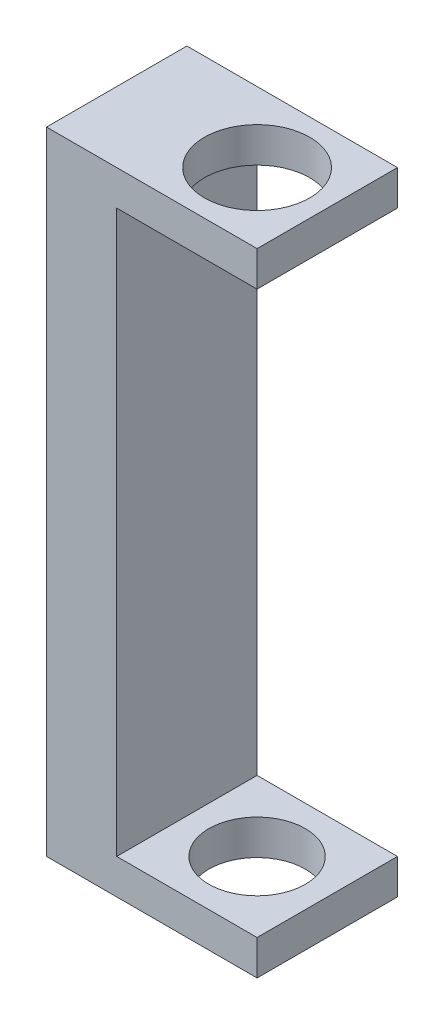
ISO-10303-21;
HEADER;
FILE_DESCRIPTION(('STEP AP214'),'2;1');
FILE_NAME('part.step','',(''),(''),'','','');
FILE_SCHEMA(('AUTOMOTIVE_DESIGN { 1 0 10303 214 1 1 1 1 }'));
ENDSEC;
DATA;
#1=APPLICATION_CONTEXT('core data for automotive mechanical design processes');
#2=APPLICATION_PROTOCOL_DEFINITION('international standard','automotive_design',2000,#1);
#3=PRODUCT_CONTEXT('',#1,'mechanical');
#4=PRODUCT('Part','Part','',(#3));
#5=PRODUCT_RELATED_PRODUCT_CATEGORY('part','',(#4));
#6=PRODUCT_DEFINITION_FORMATION('','',#4);
#7=PRODUCT_DEFINITION_CONTEXT('part definition',#1,'design');
#8=PRODUCT_DEFINITION('design','',#6,#7);
#9=PRODUCT_DEFINITION_SHAPE('','',#8);
#10=(LENGTH_UNIT() NAMED_UNIT(*) SI_UNIT(.MILLI.,.METRE.));
#11=(NAMED_UNIT(*) PLANE_ANGLE_UNIT() SI_UNIT($,.RADIAN.));
#12=(NAMED_UNIT(*) SI_UNIT($,.STERADIAN.) SOLID_ANGLE_UNIT());
#13=UNCERTAINTY_MEASURE_WITH_UNIT(LENGTH_MEASURE(1.E-05),#10,'distance_accuracy_value','');
#14=(GEOMETRIC_REPRESENTATION_CONTEXT(3) GLOBAL_UNCERTAINTY_ASSIGNED_CONTEXT((#13)) GLOBAL_UNIT_ASSIGNED_CONTEXT((#10,
#11,#12)) REPRESENTATION_CONTEXT('',''));
#15=CARTESIAN_POINT('',(0.,0.,0.));
#16=DIRECTION('',(0.,0.,1.));
#17=DIRECTION('',(1.,0.,0.));
#18=AXIS2_PLACEMENT_3D('',#15,#16,#17);
#19=CARTESIAN_POINT('',(76.2,228.6,0.));
#20=DIRECTION('',(-1.,0.,0.));
#21=DIRECTION('',(0.,0.,1.));
#22=AXIS2_PLACEMENT_3D('',#19,#20,#21);
#23=PLANE('',#22);
#24=DIRECTION('',(0.,-1.,0.));
#25=VECTOR('',#24,1.);
#26=CARTESIAN_POINT('',(76.2,228.6,-50.8));
#27=LINE('',#26,#25);
#28=CARTESIAN_POINT('',(76.2,12.7,-50.8));
#29=VERTEX_POINT('',#28);
#30=CARTESIAN_POINT('',(76.2,0.,-50.8));
#31=VERTEX_POINT('',#30);
#32=EDGE_CURVE('E207',#29,#31,#27,.T.);
#33=ORIENTED_EDGE('',*,*,#32,.F.);
#34=DIRECTION('',(0.,0.,1.));
#35=VECTOR('',#34,1.);
#36=CARTESIAN_POINT('',(76.2,12.7,-50.8));
#37=LINE('',#36,#35);
#38=CARTESIAN_POINT('',(76.2,12.7,0.));
#39=VERTEX_POINT('',#38);
#40=EDGE_CURVE('E181',#29,#39,#37,.T.);
#41=ORIENTED_EDGE('',*,*,#40,.T.);
#42=DIRECTION('',(0.,-1.,0.));
#43=VECTOR('',#42,1.);
#44=CARTESIAN_POINT('',(76.2,228.6,0.));
#45=LINE('',#44,#43);
#46=CARTESIAN_POINT('',(76.2,0.,0.));
#47=VERTEX_POINT('',#46);
#48=EDGE_CURVE('E210',#39,#47,#45,.T.);
#49=ORIENTED_EDGE('',*,*,#48,.T.);
#50=DIRECTION('',(0.,0.,-1.));
#51=VECTOR('',#50,1.);
#52=CARTESIAN_POINT('',(76.2,0.,0.));
#53=LINE('',#52,#51);
#54=EDGE_CURVE('E202',#47,#31,#53,.T.);
#55=ORIENTED_EDGE('',*,*,#54,.T.);
#56=EDGE_LOOP('',(#33,#41,#49,#55));
#57=FACE_BOUND('',#56,.T.);
#58=ADVANCED_FACE('F37',(#57),#23,.F.);
#59=CARTESIAN_POINT('',(0.,228.6,0.));
#60=DIRECTION('',(1.,0.,0.));
#61=DIRECTION('',(0.,0.,-1.));
#62=AXIS2_PLACEMENT_3D('',#59,#60,#61);
#63=PLANE('',#62);
#64=DIRECTION('',(0.,0.,1.));
#65=VECTOR('',#64,1.);
#66=CARTESIAN_POINT('',(0.,0.,0.));
#67=LINE('',#66,#65);
#68=CARTESIAN_POINT('',(0.,0.,-50.8));
#69=VERTEX_POINT('',#68);
#70=CARTESIAN_POINT('',(0.,0.,0.));
#71=VERTEX_POINT('',#70);
#72=EDGE_CURVE('E184',#69,#71,#67,.T.);
#73=ORIENTED_EDGE('',*,*,#72,.T.);
#74=DIRECTION('',(0.,-1.,0.));
#75=VECTOR('',#74,1.);
#76=CARTESIAN_POINT('',(0.,228.6,0.));
#77=LINE('',#76,#75);
#78=CARTESIAN_POINT('',(0.,228.6,0.));
#79=VERTEX_POINT('',#78);
#80=EDGE_CURVE('E11',#79,#71,#77,.T.);
#81=ORIENTED_EDGE('',*,*,#80,.F.);
#82=DIRECTION('',(0.,0.,1.));
#83=VECTOR('',#82,1.);
#84=CARTESIAN_POINT('',(0.,228.6,0.));
#85=LINE('',#84,#83);
#86=CARTESIAN_POINT('',(0.,228.6,-50.8));
#87=VERTEX_POINT('',#86);
#88=EDGE_CURVE('E190',#87,#79,#85,.T.);
#89=ORIENTED_EDGE('',*,*,#88,.F.);
#90=DIRECTION('',(0.,-1.,0.));
#91=VECTOR('',#90,1.);
#92=CARTESIAN_POINT('',(0.,228.6,-50.8));
#93=LINE('',#92,#91);
#94=EDGE_CURVE('E196',#87,#69,#93,.T.);
#95=ORIENTED_EDGE('',*,*,#94,.T.);
#96=EDGE_LOOP('',(#73,#81,#89,#95));
#97=FACE_BOUND('',#96,.T.);
#98=ADVANCED_FACE('F39',(#97),#63,.F.);
#99=CARTESIAN_POINT('',(0.,228.6,0.));
#100=DIRECTION('',(0.,0.,-1.));
#101=DIRECTION('',(-1.,0.,0.));
#102=AXIS2_PLACEMENT_3D('',#99,#100,#101);
#103=PLANE('',#102);
#104=ORIENTED_EDGE('',*,*,#48,.F.);
#105=DIRECTION('',(1.,0.,0.));
#106=VECTOR('',#105,1.);
#107=CARTESIAN_POINT('',(76.2,12.7,0.));
#108=LINE('',#107,#106);
#109=CARTESIAN_POINT('',(25.4,12.7,0.));
#110=VERTEX_POINT('',#109);
#111=EDGE_CURVE('E169',#110,#39,#108,.T.);
#112=ORIENTED_EDGE('',*,*,#111,.F.);
#113=DIRECTION('',(0.,-1.,0.));
#114=VECTOR('',#113,1.);
#115=CARTESIAN_POINT('',(25.4,215.9,0.));
#116=LINE('',#115,#114);
#117=CARTESIAN_POINT('',(25.4,215.9,0.));
#118=VERTEX_POINT('',#117);
#119=EDGE_CURVE('E177',#118,#110,#116,.T.);
#120=ORIENTED_EDGE('',*,*,#119,.F.);
#121=DIRECTION('',(-1.,0.,0.));
#122=VECTOR('',#121,1.);
#123=CARTESIAN_POINT('',(76.2,215.9,0.));
#124=LINE('',#123,#122);
#125=CARTESIAN_POINT('',(76.2,215.9,0.));
#126=VERTEX_POINT('',#125);
#127=EDGE_CURVE('E165',#126,#118,#124,.T.);
#128=ORIENTED_EDGE('',*,*,#127,.F.);
#129=CARTESIAN_POINT('',(76.2,228.6,0.));
#130=VERTEX_POINT('',#129);
#131=EDGE_CURVE('E45',#130,#126,#45,.T.);
#132=ORIENTED_EDGE('',*,*,#131,.F.);
#133=DIRECTION('',(1.,0.,0.));
#134=VECTOR('',#133,1.);
#135=CARTESIAN_POINT('',(0.,228.6,0.));
#136=LINE('',#135,#134);
#137=EDGE_CURVE('E88',#79,#130,#136,.T.);
#138=ORIENTED_EDGE('',*,*,#137,.F.);
#139=ORIENTED_EDGE('',*,*,#80,.T.);
#140=DIRECTION('',(1.,0.,0.));
#141=VECTOR('',#140,1.);
#142=CARTESIAN_POINT('',(0.,0.,0.));
#143=LINE('',#142,#141);
#144=EDGE_CURVE('E199',#71,#47,#143,.T.);
#145=ORIENTED_EDGE('',*,*,#144,.T.);
#146=EDGE_LOOP('',(#104,#112,#120,#128,#132,#138,#139,#145));
#147=FACE_BOUND('',#146,.T.);
#148=ADVANCED_FACE('F220',(#147),#103,.F.);
#149=ORIENTED_EDGE('',*,*,#131,.T.);
#150=DIRECTION('',(0.,0.,1.));
#151=VECTOR('',#150,1.);
#152=CARTESIAN_POINT('',(76.2,215.9,-50.8));
#153=LINE('',#152,#151);
#154=CARTESIAN_POINT('',(76.2,215.9,-50.8));
#155=VERTEX_POINT('',#154);
#156=EDGE_CURVE('E174',#155,#126,#153,.T.);
#157=ORIENTED_EDGE('',*,*,#156,.F.);
#158=CARTESIAN_POINT('',(76.2,228.6,-50.8));
#159=VERTEX_POINT('',#158);
#160=EDGE_CURVE('E208',#159,#155,#27,.T.);
#161=ORIENTED_EDGE('',*,*,#160,.F.);
#162=DIRECTION('',(0.,0.,-1.));
#163=VECTOR('',#162,1.);
#164=CARTESIAN_POINT('',(76.2,228.6,0.));
#165=LINE('',#164,#163);
#166=EDGE_CURVE('E193',#130,#159,#165,.T.);
#167=ORIENTED_EDGE('',*,*,#166,.F.);
#168=EDGE_LOOP('',(#149,#157,#161,#167));
#169=FACE_BOUND('',#168,.T.);
#170=ADVANCED_FACE('F229',(#169),#23,.F.);
#171=CARTESIAN_POINT('',(0.,228.6,-50.8));
#172=DIRECTION('',(0.,0.,1.));
#173=DIRECTION('',(1.,0.,0.));
#174=AXIS2_PLACEMENT_3D('',#171,#172,#173);
#175=PLANE('',#174);
#176=DIRECTION('',(0.,-1.,0.));
#177=VECTOR('',#176,1.);
#178=CARTESIAN_POINT('',(25.4,215.9,-50.8));
#179=LINE('',#178,#177);
#180=CARTESIAN_POINT('',(25.4,215.9,-50.8));
#181=VERTEX_POINT('',#180);
#182=CARTESIAN_POINT('',(25.4,12.7,-50.8));
#183=VERTEX_POINT('',#182);
#184=EDGE_CURVE('E52',#181,#183,#179,.T.);
#185=ORIENTED_EDGE('',*,*,#184,.T.);
#186=DIRECTION('',(1.,0.,0.));
#187=VECTOR('',#186,1.);
#188=CARTESIAN_POINT('',(76.2,12.7,-50.8));
#189=LINE('',#188,#187);
#190=EDGE_CURVE('E171',#183,#29,#189,.T.);
#191=ORIENTED_EDGE('',*,*,#190,.T.);
#192=ORIENTED_EDGE('',*,*,#32,.T.);
#193=DIRECTION('',(-1.,0.,0.));
#194=VECTOR('',#193,1.);
#195=CARTESIAN_POINT('',(0.,0.,-50.8));
#196=LINE('',#195,#194);
#197=EDGE_CURVE('E81',#31,#69,#196,.T.);
#198=ORIENTED_EDGE('',*,*,#197,.T.);
#199=ORIENTED_EDGE('',*,*,#94,.F.);
#200=DIRECTION('',(-1.,0.,0.));
#201=VECTOR('',#200,1.);
#202=CARTESIAN_POINT('',(0.,228.6,-50.8));
#203=LINE('',#202,#201);
#204=EDGE_CURVE('E61',#159,#87,#203,.T.);
#205=ORIENTED_EDGE('',*,*,#204,.F.);
#206=ORIENTED_EDGE('',*,*,#160,.T.);
#207=DIRECTION('',(-1.,0.,0.));
#208=VECTOR('',#207,1.);
#209=CARTESIAN_POINT('',(76.2,215.9,-50.8));
#210=LINE('',#209,#208);
#211=EDGE_CURVE('E166',#155,#181,#210,.T.);
#212=ORIENTED_EDGE('',*,*,#211,.T.);
#213=EDGE_LOOP('',(#185,#191,#192,#198,#199,#205,#206,#212));
#214=FACE_BOUND('',#213,.T.);
#215=ADVANCED_FACE('F227',(#214),#175,.F.);
#216=CARTESIAN_POINT('',(0.,228.6,0.));
#217=DIRECTION('',(0.,-1.,0.));
#218=DIRECTION('',(0.,0.,-1.));
#219=AXIS2_PLACEMENT_3D('',#216,#217,#218);
#220=PLANE('',#219);
#221=CARTESIAN_POINT('',(50.8,228.6,-25.4));
#222=DIRECTION('',(0.,1.,0.));
#223=DIRECTION('',(0.,0.,1.));
#224=AXIS2_PLACEMENT_3D('',#221,#222,#223);
#225=CIRCLE('',#224,19.05);
#226=CARTESIAN_POINT('',(50.8,228.6,-6.35));
#227=VERTEX_POINT('',#226);
#228=EDGE_CURVE('E162',#227,#227,#225,.T.);
#229=ORIENTED_EDGE('',*,*,#228,.F.);
#230=EDGE_LOOP('',(#229));
#231=FACE_BOUND('',#230,.T.);
#232=ORIENTED_EDGE('',*,*,#88,.T.);
#233=ORIENTED_EDGE('',*,*,#137,.T.);
#234=ORIENTED_EDGE('',*,*,#166,.T.);
#235=ORIENTED_EDGE('',*,*,#204,.T.);
#236=EDGE_LOOP('',(#232,#233,#234,#235));
#237=FACE_BOUND('',#236,.T.);
#238=ADVANCED_FACE('F246',(#231,#237),#220,.F.);
#239=CARTESIAN_POINT('',(0.,0.,0.));
#240=DIRECTION('',(0.,-1.,0.));
#241=DIRECTION('',(0.,0.,-1.));
#242=AXIS2_PLACEMENT_3D('',#239,#240,#241);
#243=PLANE('',#242);
#244=CARTESIAN_POINT('',(6.34999999999999,0.,-44.45));
#245=DIRECTION('',(0.,-1.,0.));
#246=DIRECTION('',(0.,0.,-1.));
#247=AXIS2_PLACEMENT_3D('',#244,#245,#246);
#248=CIRCLE('',#247,2.0193);
#249=CARTESIAN_POINT('',(6.34999999999999,0.,-46.4693));
#250=VERTEX_POINT('',#249);
#251=EDGE_CURVE('E131',#250,#250,#248,.T.);
#252=ORIENTED_EDGE('',*,*,#251,.F.);
#253=EDGE_LOOP('',(#252));
#254=FACE_BOUND('',#253,.T.);
#255=CARTESIAN_POINT('',(19.0500000000001,0.,-44.45));
#256=DIRECTION('',(0.,-1.,0.));
#257=DIRECTION('',(0.,0.,-1.));
#258=AXIS2_PLACEMENT_3D('',#255,#256,#257);
#259=CIRCLE('',#258,2.0193);
#260=CARTESIAN_POINT('',(19.0500000000001,0.,-46.4693));
#261=VERTEX_POINT('',#260);
#262=EDGE_CURVE('E130',#261,#261,#259,.T.);
#263=ORIENTED_EDGE('',*,*,#262,.F.);
#264=EDGE_LOOP('',(#263));
#265=FACE_BOUND('',#264,.T.);
#266=CARTESIAN_POINT('',(6.34999999999998,0.,-6.35));
#267=DIRECTION('',(0.,-1.,0.));
#268=DIRECTION('',(0.,0.,-1.));
#269=AXIS2_PLACEMENT_3D('',#266,#267,#268);
#270=CIRCLE('',#269,2.0193);
#271=CARTESIAN_POINT('',(6.34999999999998,0.,-8.3693));
#272=VERTEX_POINT('',#271);
#273=EDGE_CURVE('E141',#272,#272,#270,.T.);
#274=ORIENTED_EDGE('',*,*,#273,.F.);
#275=EDGE_LOOP('',(#274));
#276=FACE_BOUND('',#275,.T.);
#277=CARTESIAN_POINT('',(19.0500000000001,0.,-6.35));
#278=DIRECTION('',(0.,-1.,0.));
#279=DIRECTION('',(0.,0.,-1.));
#280=AXIS2_PLACEMENT_3D('',#277,#278,#279);
#281=CIRCLE('',#280,2.0193);
#282=CARTESIAN_POINT('',(19.0500000000001,0.,-8.3693));
#283=VERTEX_POINT('',#282);
#284=EDGE_CURVE('E147',#283,#283,#281,.T.);
#285=ORIENTED_EDGE('',*,*,#284,.F.);
#286=EDGE_LOOP('',(#285));
#287=FACE_BOUND('',#286,.T.);
#288=CARTESIAN_POINT('',(50.8,0.,-25.4));
#289=DIRECTION('',(0.,-1.,0.));
#290=DIRECTION('',(0.,0.,-1.));
#291=AXIS2_PLACEMENT_3D('',#288,#289,#290);
#292=CIRCLE('',#291,17.4625);
#293=CARTESIAN_POINT('',(50.8,0.,-42.8625));
#294=VERTEX_POINT('',#293);
#295=EDGE_CURVE('E153',#294,#294,#292,.T.);
#296=ORIENTED_EDGE('',*,*,#295,.F.);
#297=EDGE_LOOP('',(#296));
#298=FACE_BOUND('',#297,.T.);
#299=ORIENTED_EDGE('',*,*,#72,.F.);
#300=ORIENTED_EDGE('',*,*,#197,.F.);
#301=ORIENTED_EDGE('',*,*,#54,.F.);
#302=ORIENTED_EDGE('',*,*,#144,.F.);
#303=EDGE_LOOP('',(#299,#300,#301,#302));
#304=FACE_BOUND('',#303,.T.);
#305=ADVANCED_FACE('F224',(#254,#265,#276,#287,#298,#304),#243,.T.);
#306=CARTESIAN_POINT('',(76.2,12.7,-50.8));
#307=DIRECTION('',(0.,-1.,0.));
#308=DIRECTION('',(0.,0.,-1.));
#309=AXIS2_PLACEMENT_3D('',#306,#307,#308);
#310=PLANE('',#309);
#311=CARTESIAN_POINT('',(50.8,12.7,-25.4));
#312=DIRECTION('',(0.,-1.,0.));
#313=DIRECTION('',(0.,0.,-1.));
#314=AXIS2_PLACEMENT_3D('',#311,#312,#313);
#315=CIRCLE('',#314,17.4625);
#316=CARTESIAN_POINT('',(50.8,12.7,-42.8625));
#317=VERTEX_POINT('',#316);
#318=EDGE_CURVE('E156',#317,#317,#315,.F.);
#319=ORIENTED_EDGE('',*,*,#318,.F.);
#320=EDGE_LOOP('',(#319));
#321=FACE_BOUND('',#320,.T.);
#322=ORIENTED_EDGE('',*,*,#111,.T.);
#323=ORIENTED_EDGE('',*,*,#40,.F.);
#324=ORIENTED_EDGE('',*,*,#190,.F.);
#325=DIRECTION('',(0.,0.,1.));
#326=VECTOR('',#325,1.);
#327=CARTESIAN_POINT('',(25.4,12.7,-50.8));
#328=LINE('',#327,#326);
#329=EDGE_CURVE('E185',#183,#110,#328,.T.);
#330=ORIENTED_EDGE('',*,*,#329,.T.);
#331=EDGE_LOOP('',(#322,#323,#324,#330));
#332=FACE_BOUND('',#331,.T.);
#333=ADVANCED_FACE('F237',(#321,#332),#310,.F.);
#334=CARTESIAN_POINT('',(25.4,215.9,-50.8));
#335=DIRECTION('',(-1.,0.,0.));
#336=DIRECTION('',(0.,-1.,0.));
#337=AXIS2_PLACEMENT_3D('',#334,#335,#336);
#338=PLANE('',#337);
#339=ORIENTED_EDGE('',*,*,#119,.T.);
#340=ORIENTED_EDGE('',*,*,#329,.F.);
#341=ORIENTED_EDGE('',*,*,#184,.F.);
#342=DIRECTION('',(0.,0.,1.));
#343=VECTOR('',#342,1.);
#344=CARTESIAN_POINT('',(25.4,215.9,-50.8));
#345=LINE('',#344,#343);
#346=EDGE_CURVE('E187',#181,#118,#345,.T.);
#347=ORIENTED_EDGE('',*,*,#346,.T.);
#348=EDGE_LOOP('',(#339,#340,#341,#347));
#349=FACE_BOUND('',#348,.T.);
#350=ADVANCED_FACE('F234',(#349),#338,.F.);
#351=CARTESIAN_POINT('',(76.2,215.9,-50.8));
#352=DIRECTION('',(0.,1.,0.));
#353=DIRECTION('',(0.,0.,1.));
#354=AXIS2_PLACEMENT_3D('',#351,#352,#353);
#355=PLANE('',#354);
#356=CARTESIAN_POINT('',(50.8,215.9,-25.4));
#357=DIRECTION('',(0.,1.,0.));
#358=DIRECTION('',(0.,0.,1.));
#359=AXIS2_PLACEMENT_3D('',#356,#357,#358);
#360=CIRCLE('',#359,19.05);
#361=CARTESIAN_POINT('',(50.8,215.9,-6.35));
#362=VERTEX_POINT('',#361);
#363=EDGE_CURVE('E159',#362,#362,#360,.F.);
#364=ORIENTED_EDGE('',*,*,#363,.F.);
#365=EDGE_LOOP('',(#364));
#366=FACE_BOUND('',#365,.T.);
#367=ORIENTED_EDGE('',*,*,#127,.T.);
#368=ORIENTED_EDGE('',*,*,#346,.F.);
#369=ORIENTED_EDGE('',*,*,#211,.F.);
#370=ORIENTED_EDGE('',*,*,#156,.T.);
#371=EDGE_LOOP('',(#367,#368,#369,#370));
#372=FACE_BOUND('',#371,.T.);
#373=ADVANCED_FACE('F232',(#366,#372),#355,.F.);
#374=CARTESIAN_POINT('',(50.8,-0.001000000000001,-25.4));
#375=DIRECTION('',(0.,1.,0.));
#376=DIRECTION('',(0.,0.,1.));
#377=AXIS2_PLACEMENT_3D('',#374,#375,#376);
#378=CYLINDRICAL_SURFACE('',#377,19.05);
#379=ORIENTED_EDGE('',*,*,#228,.T.);
#380=EDGE_LOOP('',(#379));
#381=FACE_BOUND('',#380,.T.);
#382=ORIENTED_EDGE('',*,*,#363,.T.);
#383=EDGE_LOOP('',(#382));
#384=FACE_BOUND('',#383,.T.);
#385=ADVANCED_FACE('F300',(#381,#384),#378,.F.);
#386=CARTESIAN_POINT('',(50.8,228.601,-25.4));
#387=DIRECTION('',(0.,-1.,0.));
#388=DIRECTION('',(0.,0.,-1.));
#389=AXIS2_PLACEMENT_3D('',#386,#387,#388);
#390=CYLINDRICAL_SURFACE('',#389,17.4625);
#391=ORIENTED_EDGE('',*,*,#295,.T.);
#392=EDGE_LOOP('',(#391));
#393=FACE_BOUND('',#392,.T.);
#394=ORIENTED_EDGE('',*,*,#318,.T.);
#395=EDGE_LOOP('',(#394));
#396=FACE_BOUND('',#395,.T.);
#397=ADVANCED_FACE('F308',(#393,#396),#390,.F.);
#398=CARTESIAN_POINT('',(19.0500000000001,42.0624,-6.35));
#399=DIRECTION('',(0.,-1.,0.));
#400=DIRECTION('',(0.,0.,-1.));
#401=AXIS2_PLACEMENT_3D('',#398,#399,#400);
#402=CONICAL_SURFACE('',#401,2.01929999999999,1.02974425867665);
#403=CARTESIAN_POINT('',(19.0500000000001,43.2757178480024,-6.35));
#404=VERTEX_POINT('',#403);
#405=VERTEX_LOOP('',#404);
#406=FACE_BOUND('',#405,.T.);
#407=CARTESIAN_POINT('',(19.0500000000001,42.0624,-6.35));
#408=DIRECTION('',(0.,-1.,0.));
#409=DIRECTION('',(0.,0.,-1.));
#410=AXIS2_PLACEMENT_3D('',#407,#408,#409);
#411=CIRCLE('',#410,2.01929999999999);
#412=CARTESIAN_POINT('',(19.0500000000001,42.0624,-8.3693));
#413=VERTEX_POINT('',#412);
#414=EDGE_CURVE('E150',#413,#413,#411,.T.);
#415=ORIENTED_EDGE('',*,*,#414,.T.);
#416=EDGE_LOOP('',(#415));
#417=FACE_BOUND('',#416,.T.);
#418=ADVANCED_FACE('F315',(#406,#417),#402,.F.);
#419=CARTESIAN_POINT('',(19.0500000000001,0.,-6.35));
#420=DIRECTION('',(0.,-1.,0.));
#421=DIRECTION('',(0.,0.,-1.));
#422=AXIS2_PLACEMENT_3D('',#419,#420,#421);
#423=CYLINDRICAL_SURFACE('',#422,2.0193);
#424=ORIENTED_EDGE('',*,*,#414,.F.);
#425=EDGE_LOOP('',(#424));
#426=FACE_BOUND('',#425,.T.);
#427=ORIENTED_EDGE('',*,*,#284,.T.);
#428=EDGE_LOOP('',(#427));
#429=FACE_BOUND('',#428,.T.);
#430=ADVANCED_FACE('F324',(#426,#429),#423,.F.);
#431=CARTESIAN_POINT('',(6.34999999999998,42.0624,-6.35));
#432=DIRECTION('',(0.,-1.,0.));
#433=DIRECTION('',(0.,0.,-1.));
#434=AXIS2_PLACEMENT_3D('',#431,#432,#433);
#435=CONICAL_SURFACE('',#434,2.01929999999999,1.02974425867665);
#436=CARTESIAN_POINT('',(6.34999999999997,43.2757178480024,-6.35));
#437=VERTEX_POINT('',#436);
#438=VERTEX_LOOP('',#437);
#439=FACE_BOUND('',#438,.T.);
#440=CARTESIAN_POINT('',(6.34999999999998,42.0624,-6.35));
#441=DIRECTION('',(0.,-1.,0.));
#442=DIRECTION('',(0.,0.,-1.));
#443=AXIS2_PLACEMENT_3D('',#440,#441,#442);
#444=CIRCLE('',#443,2.01929999999999);
#445=CARTESIAN_POINT('',(6.34999999999998,42.0624,-8.3693));
#446=VERTEX_POINT('',#445);
#447=EDGE_CURVE('E144',#446,#446,#444,.T.);
#448=ORIENTED_EDGE('',*,*,#447,.T.);
#449=EDGE_LOOP('',(#448));
#450=FACE_BOUND('',#449,.T.);
#451=ADVANCED_FACE('F333',(#439,#450),#435,.F.);
#452=CARTESIAN_POINT('',(6.34999999999998,0.,-6.35));
#453=DIRECTION('',(0.,-1.,0.));
#454=DIRECTION('',(0.,0.,-1.));
#455=AXIS2_PLACEMENT_3D('',#452,#453,#454);
#456=CYLINDRICAL_SURFACE('',#455,2.0193);
#457=ORIENTED_EDGE('',*,*,#447,.F.);
#458=EDGE_LOOP('',(#457));
#459=FACE_BOUND('',#458,.T.);
#460=ORIENTED_EDGE('',*,*,#273,.T.);
#461=EDGE_LOOP('',(#460));
#462=FACE_BOUND('',#461,.T.);
#463=ADVANCED_FACE('F343',(#459,#462),#456,.F.);
#464=CARTESIAN_POINT('',(19.0500000000001,42.0624,-44.45));
#465=DIRECTION('',(0.,-1.,0.));
#466=DIRECTION('',(0.,0.,-1.));
#467=AXIS2_PLACEMENT_3D('',#464,#465,#466);
#468=CONICAL_SURFACE('',#467,2.01929999999999,1.02974425867665);
#469=CARTESIAN_POINT('',(19.0500000000001,43.2757178480024,-44.45));
#470=VERTEX_POINT('',#469);
#471=VERTEX_LOOP('',#470);
#472=FACE_BOUND('',#471,.T.);
#473=CARTESIAN_POINT('',(19.0500000000001,42.0624,-44.45));
#474=DIRECTION('',(0.,-1.,0.));
#475=DIRECTION('',(0.,0.,-1.));
#476=AXIS2_PLACEMENT_3D('',#473,#474,#475);
#477=CIRCLE('',#476,2.01929999999999);
#478=CARTESIAN_POINT('',(19.0500000000001,42.0624,-46.4693));
#479=VERTEX_POINT('',#478);
#480=EDGE_CURVE('E134',#479,#479,#477,.T.);
#481=ORIENTED_EDGE('',*,*,#480,.T.);
#482=EDGE_LOOP('',(#481));
#483=FACE_BOUND('',#482,.T.);
#484=ADVANCED_FACE('F352',(#472,#483),#468,.F.);
#485=CARTESIAN_POINT('',(19.0500000000001,0.,-44.45));
#486=DIRECTION('',(0.,-1.,0.));
#487=DIRECTION('',(0.,0.,-1.));
#488=AXIS2_PLACEMENT_3D('',#485,#486,#487);
#489=CYLINDRICAL_SURFACE('',#488,2.0193);
#490=ORIENTED_EDGE('',*,*,#480,.F.);
#491=EDGE_LOOP('',(#490));
#492=FACE_BOUND('',#491,.T.);
#493=ORIENTED_EDGE('',*,*,#262,.T.);
#494=EDGE_LOOP('',(#493));
#495=FACE_BOUND('',#494,.T.);
#496=ADVANCED_FACE('F124',(#492,#495),#489,.F.);
#497=CARTESIAN_POINT('',(6.34999999999999,42.0624,-44.45));
#498=DIRECTION('',(0.,-1.,0.));
#499=DIRECTION('',(0.,0.,-1.));
#500=AXIS2_PLACEMENT_3D('',#497,#498,#499);
#501=CONICAL_SURFACE('',#500,2.01929999999999,1.02974425867665);
#502=CARTESIAN_POINT('',(6.34999999999998,43.2757178480024,-44.45));
#503=VERTEX_POINT('',#502);
#504=VERTEX_LOOP('',#503);
#505=FACE_BOUND('',#504,.T.);
#506=CARTESIAN_POINT('',(6.34999999999999,42.0624,-44.45));
#507=DIRECTION('',(0.,-1.,0.));
#508=DIRECTION('',(0.,0.,-1.));
#509=AXIS2_PLACEMENT_3D('',#506,#507,#508);
#510=CIRCLE('',#509,2.01929999999999);
#511=CARTESIAN_POINT('',(6.34999999999999,42.0624,-46.4693));
#512=VERTEX_POINT('',#511);
#513=EDGE_CURVE('E128',#512,#512,#510,.T.);
#514=ORIENTED_EDGE('',*,*,#513,.T.);
#515=EDGE_LOOP('',(#514));
#516=FACE_BOUND('',#515,.T.);
#517=ADVANCED_FACE('F120',(#505,#516),#501,.F.);
#518=CARTESIAN_POINT('',(6.34999999999999,0.,-44.45));
#519=DIRECTION('',(0.,-1.,0.));
#520=DIRECTION('',(0.,0.,-1.));
#521=AXIS2_PLACEMENT_3D('',#518,#519,#520);
#522=CYLINDRICAL_SURFACE('',#521,2.0193);
#523=ORIENTED_EDGE('',*,*,#513,.F.);
#524=EDGE_LOOP('',(#523));
#525=FACE_BOUND('',#524,.T.);
#526=ORIENTED_EDGE('',*,*,#251,.T.);
#527=EDGE_LOOP('',(#526));
#528=FACE_BOUND('',#527,.T.);
#529=ADVANCED_FACE('F123',(#525,#528),#522,.F.);
#530=CLOSED_SHELL('',(#58,#98,#148,#170,#215,#238,#305,#333,#350,#373,#385,#397,#418,#430,#451,
#463,#484,#496,#517,#529));
#531=MANIFOLD_SOLID_BREP('B2',#530);
#532=ADVANCED_BREP_SHAPE_REPRESENTATION('',(#18,#531),#14);
#533=SHAPE_DEFINITION_REPRESENTATION(#9,#532);
ENDSEC;
END-ISO-10303-21;
